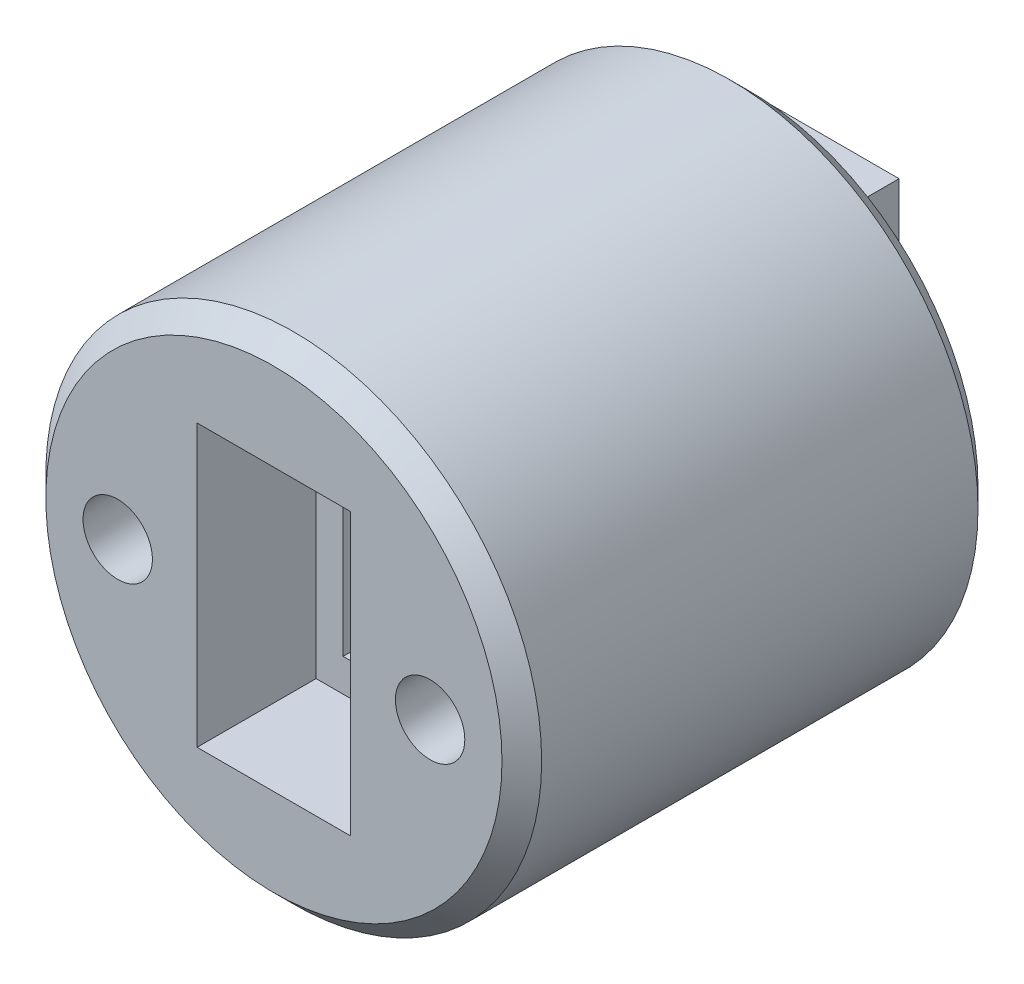
ISO-10303-21;
HEADER;
FILE_DESCRIPTION(('STEP AP214'),'2;1');
FILE_NAME('part.step','',(''),(''),'','','');
FILE_SCHEMA(('AUTOMOTIVE_DESIGN { 1 0 10303 214 1 1 1 1 }'));
ENDSEC;
DATA;
#1=APPLICATION_CONTEXT('core data for automotive mechanical design processes');
#2=APPLICATION_PROTOCOL_DEFINITION('international standard','automotive_design',2000,#1);
#3=PRODUCT_CONTEXT('',#1,'mechanical');
#4=PRODUCT('Part','Part','',(#3));
#5=PRODUCT_RELATED_PRODUCT_CATEGORY('part','',(#4));
#6=PRODUCT_DEFINITION_FORMATION('','',#4);
#7=PRODUCT_DEFINITION_CONTEXT('part definition',#1,'design');
#8=PRODUCT_DEFINITION('design','',#6,#7);
#9=PRODUCT_DEFINITION_SHAPE('','',#8);
#10=(LENGTH_UNIT() NAMED_UNIT(*) SI_UNIT(.MILLI.,.METRE.));
#11=(NAMED_UNIT(*) PLANE_ANGLE_UNIT() SI_UNIT($,.RADIAN.));
#12=(NAMED_UNIT(*) SI_UNIT($,.STERADIAN.) SOLID_ANGLE_UNIT());
#13=UNCERTAINTY_MEASURE_WITH_UNIT(LENGTH_MEASURE(1.E-05),#10,'distance_accuracy_value','');
#14=(GEOMETRIC_REPRESENTATION_CONTEXT(3) GLOBAL_UNCERTAINTY_ASSIGNED_CONTEXT((#13)) GLOBAL_UNIT_ASSIGNED_CONTEXT((#10,
#11,#12)) REPRESENTATION_CONTEXT('',''));
#15=CARTESIAN_POINT('',(0.,0.,0.));
#16=DIRECTION('',(0.,0.,1.));
#17=DIRECTION('',(1.,0.,0.));
#18=AXIS2_PLACEMENT_3D('',#15,#16,#17);
#19=CARTESIAN_POINT('',(0.,0.,0.));
#20=DIRECTION('',(0.,0.,1.));
#21=DIRECTION('',(1.,0.,0.));
#22=AXIS2_PLACEMENT_3D('',#19,#20,#21);
#23=PLANE('',#22);
#24=CARTESIAN_POINT('',(-7.875,0.,0.));
#25=DIRECTION('',(0.,0.,1.));
#26=DIRECTION('',(1.,0.,0.));
#27=AXIS2_PLACEMENT_3D('',#24,#25,#26);
#28=CIRCLE('',#27,1.75);
#29=CARTESIAN_POINT('',(-6.125,0.,0.));
#30=VERTEX_POINT('',#29);
#31=EDGE_CURVE('E205',#30,#30,#28,.T.);
#32=ORIENTED_EDGE('',*,*,#31,.T.);
#33=EDGE_LOOP('',(#32));
#34=FACE_BOUND('',#33,.T.);
#35=CARTESIAN_POINT('',(7.875,0.,0.));
#36=DIRECTION('',(0.,0.,1.));
#37=DIRECTION('',(1.,0.,0.));
#38=AXIS2_PLACEMENT_3D('',#35,#36,#37);
#39=CIRCLE('',#38,1.75);
#40=CARTESIAN_POINT('',(9.625,0.,0.));
#41=VERTEX_POINT('',#40);
#42=EDGE_CURVE('E198',#41,#41,#39,.T.);
#43=ORIENTED_EDGE('',*,*,#42,.T.);
#44=EDGE_LOOP('',(#43));
#45=FACE_BOUND('',#44,.T.);
#46=CARTESIAN_POINT('',(0.,0.,0.));
#47=DIRECTION('',(0.,0.,1.));
#48=DIRECTION('',(1.,0.,0.));
#49=AXIS2_PLACEMENT_3D('',#46,#47,#48);
#50=CIRCLE('',#49,11.5);
#51=CARTESIAN_POINT('',(11.5,0.,0.));
#52=VERTEX_POINT('',#51);
#53=EDGE_CURVE('E325',#52,#52,#50,.F.);
#54=ORIENTED_EDGE('',*,*,#53,.T.);
#55=EDGE_LOOP('',(#54));
#56=FACE_BOUND('',#55,.T.);
#57=DIRECTION('',(0.,1.,0.));
#58=VECTOR('',#57,1.);
#59=CARTESIAN_POINT('',(-3.52077735464872,7.4439292641144,0.));
#60=LINE('',#59,#58);
#61=CARTESIAN_POINT('',(-3.52077735464872,-7.4439292641144,0.));
#62=VERTEX_POINT('',#61);
#63=CARTESIAN_POINT('',(-3.52077735464872,7.4439292641144,0.));
#64=VERTEX_POINT('',#63);
#65=EDGE_CURVE('E210',#62,#64,#60,.T.);
#66=ORIENTED_EDGE('',*,*,#65,.F.);
#67=DIRECTION('',(-1.,0.,0.));
#68=VECTOR('',#67,1.);
#69=CARTESIAN_POINT('',(3.52077735464872,-7.4439292641144,0.));
#70=LINE('',#69,#68);
#71=CARTESIAN_POINT('',(3.52077735464872,-7.4439292641144,0.));
#72=VERTEX_POINT('',#71);
#73=EDGE_CURVE('E223',#72,#62,#70,.T.);
#74=ORIENTED_EDGE('',*,*,#73,.F.);
#75=DIRECTION('',(0.,-1.,0.));
#76=VECTOR('',#75,1.);
#77=CARTESIAN_POINT('',(3.52077735464872,7.4439292641144,0.));
#78=LINE('',#77,#76);
#79=CARTESIAN_POINT('',(3.52077735464872,7.4439292641144,0.));
#80=VERTEX_POINT('',#79);
#81=EDGE_CURVE('E219',#80,#72,#78,.T.);
#82=ORIENTED_EDGE('',*,*,#81,.F.);
#83=DIRECTION('',(1.,0.,0.));
#84=VECTOR('',#83,1.);
#85=CARTESIAN_POINT('',(3.52077735464872,7.4439292641144,0.));
#86=LINE('',#85,#84);
#87=EDGE_CURVE('E214',#64,#80,#86,.T.);
#88=ORIENTED_EDGE('',*,*,#87,.F.);
#89=EDGE_LOOP('',(#66,#74,#82,#88));
#90=FACE_BOUND('',#89,.T.);
#91=ADVANCED_FACE('F41',(#34,#45,#56,#90),#23,.F.);
#92=CARTESIAN_POINT('',(0.,0.,24.));
#93=DIRECTION('',(0.,0.,-1.));
#94=DIRECTION('',(-1.,0.,0.));
#95=AXIS2_PLACEMENT_3D('',#92,#93,#94);
#96=CYLINDRICAL_SURFACE('',#95,12.5);
#97=CARTESIAN_POINT('',(0.,0.,23.));
#98=DIRECTION('',(0.,0.,1.));
#99=DIRECTION('',(1.,0.,0.));
#100=AXIS2_PLACEMENT_3D('',#97,#98,#99);
#101=CIRCLE('',#100,12.5);
#102=CARTESIAN_POINT('',(12.5,0.,23.));
#103=VERTEX_POINT('',#102);
#104=EDGE_CURVE('E11',#103,#103,#101,.F.);
#105=ORIENTED_EDGE('',*,*,#104,.T.);
#106=EDGE_LOOP('',(#105));
#107=FACE_BOUND('',#106,.T.);
#108=CARTESIAN_POINT('',(0.,0.,1.));
#109=DIRECTION('',(0.,0.,1.));
#110=DIRECTION('',(1.,0.,0.));
#111=AXIS2_PLACEMENT_3D('',#108,#109,#110);
#112=CIRCLE('',#111,12.5);
#113=CARTESIAN_POINT('',(12.5,0.,1.));
#114=VERTEX_POINT('',#113);
#115=EDGE_CURVE('E309',#114,#114,#112,.T.);
#116=ORIENTED_EDGE('',*,*,#115,.T.);
#117=EDGE_LOOP('',(#116));
#118=FACE_BOUND('',#117,.T.);
#119=ADVANCED_FACE('F349',(#107,#118),#96,.T.);
#120=CARTESIAN_POINT('',(0.,0.,24.));
#121=DIRECTION('',(0.,0.,1.));
#122=DIRECTION('',(1.,0.,0.));
#123=AXIS2_PLACEMENT_3D('',#120,#121,#122);
#124=PLANE('',#123);
#125=CARTESIAN_POINT('',(0.,0.,24.));
#126=DIRECTION('',(0.,0.,1.));
#127=DIRECTION('',(1.,0.,0.));
#128=AXIS2_PLACEMENT_3D('',#125,#126,#127);
#129=CIRCLE('',#128,11.5);
#130=CARTESIAN_POINT('',(11.5,0.,24.));
#131=VERTEX_POINT('',#130);
#132=EDGE_CURVE('E51',#131,#131,#129,.T.);
#133=ORIENTED_EDGE('',*,*,#132,.T.);
#134=EDGE_LOOP('',(#133));
#135=FACE_BOUND('',#134,.T.);
#136=CARTESIAN_POINT('',(-7.875,0.,24.));
#137=DIRECTION('',(0.,0.,1.));
#138=DIRECTION('',(1.,0.,0.));
#139=AXIS2_PLACEMENT_3D('',#136,#137,#138);
#140=CIRCLE('',#139,1.75);
#141=CARTESIAN_POINT('',(-6.125,0.,24.));
#142=VERTEX_POINT('',#141);
#143=EDGE_CURVE('E194',#142,#142,#140,.T.);
#144=ORIENTED_EDGE('',*,*,#143,.F.);
#145=EDGE_LOOP('',(#144));
#146=FACE_BOUND('',#145,.T.);
#147=CARTESIAN_POINT('',(7.875,0.,24.));
#148=DIRECTION('',(0.,0.,1.));
#149=DIRECTION('',(-1.,0.,0.));
#150=AXIS2_PLACEMENT_3D('',#147,#148,#149);
#151=CIRCLE('',#150,1.75);
#152=CARTESIAN_POINT('',(9.625,0.,24.));
#153=VERTEX_POINT('',#152);
#154=EDGE_CURVE('E188',#153,#153,#151,.T.);
#155=ORIENTED_EDGE('',*,*,#154,.F.);
#156=EDGE_LOOP('',(#155));
#157=FACE_BOUND('',#156,.T.);
#158=DIRECTION('',(0.,1.,0.));
#159=VECTOR('',#158,1.);
#160=CARTESIAN_POINT('',(3.87302995142412,7.08115133493844,24.));
#161=LINE('',#160,#159);
#162=CARTESIAN_POINT('',(3.87302995142412,-7.08115133493844,24.));
#163=VERTEX_POINT('',#162);
#164=CARTESIAN_POINT('',(3.87302995142412,7.08115133493844,24.));
#165=VERTEX_POINT('',#164);
#166=EDGE_CURVE('E239',#163,#165,#161,.T.);
#167=ORIENTED_EDGE('',*,*,#166,.F.);
#168=DIRECTION('',(1.,0.,0.));
#169=VECTOR('',#168,1.);
#170=CARTESIAN_POINT('',(-3.87302995142412,-7.08115133493844,24.));
#171=LINE('',#170,#169);
#172=CARTESIAN_POINT('',(-3.87302995142412,-7.08115133493844,24.));
#173=VERTEX_POINT('',#172);
#174=EDGE_CURVE('E245',#173,#163,#171,.T.);
#175=ORIENTED_EDGE('',*,*,#174,.F.);
#176=DIRECTION('',(0.,-1.,0.));
#177=VECTOR('',#176,1.);
#178=CARTESIAN_POINT('',(-3.87302995142412,7.08115133493844,24.));
#179=LINE('',#178,#177);
#180=CARTESIAN_POINT('',(-3.87302995142412,7.08115133493844,24.));
#181=VERTEX_POINT('',#180);
#182=EDGE_CURVE('E264',#181,#173,#179,.T.);
#183=ORIENTED_EDGE('',*,*,#182,.F.);
#184=DIRECTION('',(-1.,0.,0.));
#185=VECTOR('',#184,1.);
#186=CARTESIAN_POINT('',(-3.87302995142412,7.08115133493844,24.));
#187=LINE('',#186,#185);
#188=EDGE_CURVE('E260',#165,#181,#187,.T.);
#189=ORIENTED_EDGE('',*,*,#188,.F.);
#190=EDGE_LOOP('',(#167,#175,#183,#189));
#191=FACE_BOUND('',#190,.T.);
#192=ADVANCED_FACE('F332',(#135,#146,#157,#191),#124,.T.);
#193=CARTESIAN_POINT('',(3.87302995142412,7.08115133493844,18.));
#194=DIRECTION('',(1.,0.,0.));
#195=DIRECTION('',(0.,0.,-1.));
#196=AXIS2_PLACEMENT_3D('',#193,#194,#195);
#197=PLANE('',#196);
#198=ORIENTED_EDGE('',*,*,#166,.T.);
#199=DIRECTION('',(0.,0.,1.));
#200=VECTOR('',#199,1.);
#201=CARTESIAN_POINT('',(3.87302995142412,7.08115133493844,18.));
#202=LINE('',#201,#200);
#203=CARTESIAN_POINT('',(3.87302995142412,7.08115133493844,18.));
#204=VERTEX_POINT('',#203);
#205=EDGE_CURVE('E257',#204,#165,#202,.T.);
#206=ORIENTED_EDGE('',*,*,#205,.F.);
#207=DIRECTION('',(0.,1.,0.));
#208=VECTOR('',#207,1.);
#209=CARTESIAN_POINT('',(3.87302995142412,7.08115133493844,18.));
#210=LINE('',#209,#208);
#211=CARTESIAN_POINT('',(3.87302995142412,-7.08115133493844,18.));
#212=VERTEX_POINT('',#211);
#213=EDGE_CURVE('E240',#212,#204,#210,.T.);
#214=ORIENTED_EDGE('',*,*,#213,.F.);
#215=DIRECTION('',(0.,0.,1.));
#216=VECTOR('',#215,1.);
#217=CARTESIAN_POINT('',(3.87302995142412,-7.08115133493844,18.));
#218=LINE('',#217,#216);
#219=EDGE_CURVE('E271',#212,#163,#218,.T.);
#220=ORIENTED_EDGE('',*,*,#219,.T.);
#221=EDGE_LOOP('',(#198,#206,#214,#220));
#222=FACE_BOUND('',#221,.T.);
#223=ADVANCED_FACE('F450',(#222),#197,.F.);
#224=CARTESIAN_POINT('',(-3.87302995142412,-7.08115133493844,18.));
#225=DIRECTION('',(0.,-1.,0.));
#226=DIRECTION('',(0.,0.,-1.));
#227=AXIS2_PLACEMENT_3D('',#224,#225,#226);
#228=PLANE('',#227);
#229=ORIENTED_EDGE('',*,*,#174,.T.);
#230=ORIENTED_EDGE('',*,*,#219,.F.);
#231=DIRECTION('',(1.,0.,0.));
#232=VECTOR('',#231,1.);
#233=CARTESIAN_POINT('',(-3.87302995142412,-7.08115133493844,18.));
#234=LINE('',#233,#232);
#235=CARTESIAN_POINT('',(-3.87302995142412,-7.08115133493844,18.));
#236=VERTEX_POINT('',#235);
#237=EDGE_CURVE('E253',#236,#212,#234,.T.);
#238=ORIENTED_EDGE('',*,*,#237,.F.);
#239=DIRECTION('',(0.,0.,1.));
#240=VECTOR('',#239,1.);
#241=CARTESIAN_POINT('',(-3.87302995142412,-7.08115133493844,18.));
#242=LINE('',#241,#240);
#243=EDGE_CURVE('E275',#236,#173,#242,.T.);
#244=ORIENTED_EDGE('',*,*,#243,.T.);
#245=EDGE_LOOP('',(#229,#230,#238,#244));
#246=FACE_BOUND('',#245,.T.);
#247=ADVANCED_FACE('F446',(#246),#228,.F.);
#248=CARTESIAN_POINT('',(-3.87302995142412,7.08115133493844,18.));
#249=DIRECTION('',(-1.,0.,0.));
#250=DIRECTION('',(0.,0.,1.));
#251=AXIS2_PLACEMENT_3D('',#248,#249,#250);
#252=PLANE('',#251);
#253=ORIENTED_EDGE('',*,*,#182,.T.);
#254=ORIENTED_EDGE('',*,*,#243,.F.);
#255=DIRECTION('',(0.,-1.,0.));
#256=VECTOR('',#255,1.);
#257=CARTESIAN_POINT('',(-3.87302995142412,7.08115133493844,18.));
#258=LINE('',#257,#256);
#259=CARTESIAN_POINT('',(-3.87302995142412,7.08115133493844,18.));
#260=VERTEX_POINT('',#259);
#261=EDGE_CURVE('E249',#260,#236,#258,.T.);
#262=ORIENTED_EDGE('',*,*,#261,.F.);
#263=DIRECTION('',(0.,0.,1.));
#264=VECTOR('',#263,1.);
#265=CARTESIAN_POINT('',(-3.87302995142412,7.08115133493844,18.));
#266=LINE('',#265,#264);
#267=EDGE_CURVE('E278',#260,#181,#266,.T.);
#268=ORIENTED_EDGE('',*,*,#267,.T.);
#269=EDGE_LOOP('',(#253,#254,#262,#268));
#270=FACE_BOUND('',#269,.T.);
#271=ADVANCED_FACE('F449',(#270),#252,.F.);
#272=CARTESIAN_POINT('',(-3.87302995142412,7.08115133493844,18.));
#273=DIRECTION('',(0.,1.,0.));
#274=DIRECTION('',(0.,0.,1.));
#275=AXIS2_PLACEMENT_3D('',#272,#273,#274);
#276=PLANE('',#275);
#277=ORIENTED_EDGE('',*,*,#188,.T.);
#278=ORIENTED_EDGE('',*,*,#267,.F.);
#279=DIRECTION('',(-1.,0.,0.));
#280=VECTOR('',#279,1.);
#281=CARTESIAN_POINT('',(-3.87302995142412,7.08115133493844,18.));
#282=LINE('',#281,#280);
#283=EDGE_CURVE('E244',#204,#260,#282,.T.);
#284=ORIENTED_EDGE('',*,*,#283,.F.);
#285=ORIENTED_EDGE('',*,*,#205,.T.);
#286=EDGE_LOOP('',(#277,#278,#284,#285));
#287=FACE_BOUND('',#286,.T.);
#288=ADVANCED_FACE('F441',(#287),#276,.F.);
#289=CARTESIAN_POINT('',(0.,0.,18.));
#290=DIRECTION('',(0.,0.,1.));
#291=DIRECTION('',(1.,0.,0.));
#292=AXIS2_PLACEMENT_3D('',#289,#290,#291);
#293=PLANE('',#292);
#294=DIRECTION('',(0.,1.,0.));
#295=VECTOR('',#294,1.);
#296=CARTESIAN_POINT('',(2.51484096760623,5.43205649002941,18.));
#297=LINE('',#296,#295);
#298=CARTESIAN_POINT('',(2.51484096760623,-5.43205649002941,18.));
#299=VERTEX_POINT('',#298);
#300=CARTESIAN_POINT('',(2.51484096760623,5.43205649002941,18.));
#301=VERTEX_POINT('',#300);
#302=EDGE_CURVE('E150',#299,#301,#297,.T.);
#303=ORIENTED_EDGE('',*,*,#302,.F.);
#304=DIRECTION('',(1.,0.,0.));
#305=VECTOR('',#304,1.);
#306=CARTESIAN_POINT('',(-2.51484096760623,-5.43205649002941,18.));
#307=LINE('',#306,#305);
#308=CARTESIAN_POINT('',(-2.51484096760623,-5.43205649002941,18.));
#309=VERTEX_POINT('',#308);
#310=EDGE_CURVE('E168',#309,#299,#307,.T.);
#311=ORIENTED_EDGE('',*,*,#310,.F.);
#312=DIRECTION('',(0.,-1.,0.));
#313=VECTOR('',#312,1.);
#314=CARTESIAN_POINT('',(-2.51484096760623,5.43205649002941,18.));
#315=LINE('',#314,#313);
#316=CARTESIAN_POINT('',(-2.51484096760623,5.43205649002941,18.));
#317=VERTEX_POINT('',#316);
#318=EDGE_CURVE('E58',#317,#309,#315,.T.);
#319=ORIENTED_EDGE('',*,*,#318,.F.);
#320=DIRECTION('',(-1.,0.,0.));
#321=VECTOR('',#320,1.);
#322=CARTESIAN_POINT('',(-2.51484096760623,5.43205649002941,18.));
#323=LINE('',#322,#321);
#324=EDGE_CURVE('E180',#301,#317,#323,.T.);
#325=ORIENTED_EDGE('',*,*,#324,.F.);
#326=EDGE_LOOP('',(#303,#311,#319,#325));
#327=FACE_BOUND('',#326,.T.);
#328=ORIENTED_EDGE('',*,*,#213,.T.);
#329=ORIENTED_EDGE('',*,*,#283,.T.);
#330=ORIENTED_EDGE('',*,*,#261,.T.);
#331=ORIENTED_EDGE('',*,*,#237,.T.);
#332=EDGE_LOOP('',(#328,#329,#330,#331));
#333=FACE_BOUND('',#332,.T.);
#334=ADVANCED_FACE('F434',(#327,#333),#293,.T.);
#335=CARTESIAN_POINT('',(-3.52077735464872,7.4439292641144,-5.));
#336=DIRECTION('',(1.,0.,0.));
#337=DIRECTION('',(0.,0.,-1.));
#338=AXIS2_PLACEMENT_3D('',#335,#336,#337);
#339=PLANE('',#338);
#340=DIRECTION('',(0.,0.,1.));
#341=VECTOR('',#340,1.);
#342=CARTESIAN_POINT('',(-3.52077735464872,7.4439292641144,-5.));
#343=LINE('',#342,#341);
#344=CARTESIAN_POINT('',(-3.52077735464872,7.4439292641144,-4.));
#345=VERTEX_POINT('',#344);
#346=EDGE_CURVE('E236',#345,#64,#343,.T.);
#347=ORIENTED_EDGE('',*,*,#346,.F.);
#348=DIRECTION('',(0.,-1.,0.));
#349=VECTOR('',#348,1.);
#350=CARTESIAN_POINT('',(-3.52077735464872,-7.4439292641144,-4.));
#351=LINE('',#350,#349);
#352=CARTESIAN_POINT('',(-3.52077735464872,-7.4439292641144,-4.));
#353=VERTEX_POINT('',#352);
#354=EDGE_CURVE('E296',#345,#353,#351,.T.);
#355=ORIENTED_EDGE('',*,*,#354,.T.);
#356=DIRECTION('',(0.,0.,1.));
#357=VECTOR('',#356,1.);
#358=CARTESIAN_POINT('',(-3.52077735464872,-7.4439292641144,-5.));
#359=LINE('',#358,#357);
#360=EDGE_CURVE('E227',#353,#62,#359,.T.);
#361=ORIENTED_EDGE('',*,*,#360,.T.);
#362=ORIENTED_EDGE('',*,*,#65,.T.);
#363=EDGE_LOOP('',(#347,#355,#361,#362));
#364=FACE_BOUND('',#363,.T.);
#365=ADVANCED_FACE('F432',(#364),#339,.F.);
#366=CARTESIAN_POINT('',(3.52077735464872,7.4439292641144,-5.));
#367=DIRECTION('',(0.,-1.,0.));
#368=DIRECTION('',(0.,0.,-1.));
#369=AXIS2_PLACEMENT_3D('',#366,#367,#368);
#370=PLANE('',#369);
#371=DIRECTION('',(0.,0.,1.));
#372=VECTOR('',#371,1.);
#373=CARTESIAN_POINT('',(3.52077735464872,7.4439292641144,-5.));
#374=LINE('',#373,#372);
#375=CARTESIAN_POINT('',(3.52077735464872,7.4439292641144,-4.));
#376=VERTEX_POINT('',#375);
#377=EDGE_CURVE('E233',#376,#80,#374,.T.);
#378=ORIENTED_EDGE('',*,*,#377,.F.);
#379=DIRECTION('',(-1.,0.,0.));
#380=VECTOR('',#379,1.);
#381=CARTESIAN_POINT('',(-3.52077735464872,7.4439292641144,-4.));
#382=LINE('',#381,#380);
#383=EDGE_CURVE('E303',#376,#345,#382,.T.);
#384=ORIENTED_EDGE('',*,*,#383,.T.);
#385=ORIENTED_EDGE('',*,*,#346,.T.);
#386=ORIENTED_EDGE('',*,*,#87,.T.);
#387=EDGE_LOOP('',(#378,#384,#385,#386));
#388=FACE_BOUND('',#387,.T.);
#389=ADVANCED_FACE('F430',(#388),#370,.F.);
#390=CARTESIAN_POINT('',(3.52077735464872,7.4439292641144,-5.));
#391=DIRECTION('',(-1.,0.,0.));
#392=DIRECTION('',(0.,0.,1.));
#393=AXIS2_PLACEMENT_3D('',#390,#391,#392);
#394=PLANE('',#393);
#395=DIRECTION('',(0.,0.,1.));
#396=VECTOR('',#395,1.);
#397=CARTESIAN_POINT('',(3.52077735464872,-7.4439292641144,-5.));
#398=LINE('',#397,#396);
#399=CARTESIAN_POINT('',(3.52077735464872,-7.4439292641144,-4.));
#400=VERTEX_POINT('',#399);
#401=EDGE_CURVE('E230',#400,#72,#398,.T.);
#402=ORIENTED_EDGE('',*,*,#401,.F.);
#403=DIRECTION('',(0.,1.,0.));
#404=VECTOR('',#403,1.);
#405=CARTESIAN_POINT('',(3.52077735464872,7.4439292641144,-4.));
#406=LINE('',#405,#404);
#407=EDGE_CURVE('E306',#400,#376,#406,.T.);
#408=ORIENTED_EDGE('',*,*,#407,.T.);
#409=ORIENTED_EDGE('',*,*,#377,.T.);
#410=ORIENTED_EDGE('',*,*,#81,.T.);
#411=EDGE_LOOP('',(#402,#408,#409,#410));
#412=FACE_BOUND('',#411,.T.);
#413=ADVANCED_FACE('F418',(#412),#394,.F.);
#414=CARTESIAN_POINT('',(3.52077735464872,-7.4439292641144,-5.));
#415=DIRECTION('',(0.,1.,0.));
#416=DIRECTION('',(0.,0.,1.));
#417=AXIS2_PLACEMENT_3D('',#414,#415,#416);
#418=PLANE('',#417);
#419=ORIENTED_EDGE('',*,*,#360,.F.);
#420=DIRECTION('',(1.,0.,0.));
#421=VECTOR('',#420,1.);
#422=CARTESIAN_POINT('',(3.52077735464872,-7.4439292641144,-4.));
#423=LINE('',#422,#421);
#424=EDGE_CURVE('E300',#353,#400,#423,.T.);
#425=ORIENTED_EDGE('',*,*,#424,.T.);
#426=ORIENTED_EDGE('',*,*,#401,.T.);
#427=ORIENTED_EDGE('',*,*,#73,.T.);
#428=EDGE_LOOP('',(#419,#425,#426,#427));
#429=FACE_BOUND('',#428,.T.);
#430=ADVANCED_FACE('F413',(#429),#418,.F.);
#431=CARTESIAN_POINT('',(0.,0.,-5.));
#432=DIRECTION('',(0.,0.,-1.));
#433=DIRECTION('',(-1.,0.,0.));
#434=AXIS2_PLACEMENT_3D('',#431,#432,#433);
#435=PLANE('',#434);
#436=DIRECTION('',(0.,1.,0.));
#437=VECTOR('',#436,1.);
#438=CARTESIAN_POINT('',(2.51484096760623,5.43205649002941,-5.));
#439=LINE('',#438,#437);
#440=CARTESIAN_POINT('',(2.51484096760623,-5.43205649002941,-5.));
#441=VERTEX_POINT('',#440);
#442=CARTESIAN_POINT('',(2.51484096760623,5.43205649002941,-5.));
#443=VERTEX_POINT('',#442);
#444=EDGE_CURVE('E147',#441,#443,#439,.T.);
#445=ORIENTED_EDGE('',*,*,#444,.T.);
#446=DIRECTION('',(-1.,0.,0.));
#447=VECTOR('',#446,1.);
#448=CARTESIAN_POINT('',(-2.51484096760623,5.43205649002941,-5.));
#449=LINE('',#448,#447);
#450=CARTESIAN_POINT('',(-2.51484096760623,5.43205649002941,-5.));
#451=VERTEX_POINT('',#450);
#452=EDGE_CURVE('E159',#443,#451,#449,.T.);
#453=ORIENTED_EDGE('',*,*,#452,.T.);
#454=DIRECTION('',(0.,-1.,0.));
#455=VECTOR('',#454,1.);
#456=CARTESIAN_POINT('',(-2.51484096760623,5.43205649002941,-5.));
#457=LINE('',#456,#455);
#458=CARTESIAN_POINT('',(-2.51484096760623,-5.43205649002941,-5.));
#459=VERTEX_POINT('',#458);
#460=EDGE_CURVE('E63',#451,#459,#457,.T.);
#461=ORIENTED_EDGE('',*,*,#460,.T.);
#462=DIRECTION('',(1.,0.,0.));
#463=VECTOR('',#462,1.);
#464=CARTESIAN_POINT('',(-2.51484096760623,-5.43205649002941,-5.));
#465=LINE('',#464,#463);
#466=EDGE_CURVE('E156',#459,#441,#465,.T.);
#467=ORIENTED_EDGE('',*,*,#466,.T.);
#468=EDGE_LOOP('',(#445,#453,#461,#467));
#469=FACE_BOUND('',#468,.T.);
#470=DIRECTION('',(-1.,0.,0.));
#471=VECTOR('',#470,1.);
#472=CARTESIAN_POINT('',(-3.52077735464872,-6.44392926411441,-5.));
#473=LINE('',#472,#471);
#474=CARTESIAN_POINT('',(2.52077735464873,-6.44392926411441,-5.));
#475=VERTEX_POINT('',#474);
#476=CARTESIAN_POINT('',(-2.52077735464873,-6.44392926411441,-5.));
#477=VERTEX_POINT('',#476);
#478=EDGE_CURVE('E289',#475,#477,#473,.T.);
#479=ORIENTED_EDGE('',*,*,#478,.T.);
#480=DIRECTION('',(0.,1.,0.));
#481=VECTOR('',#480,1.);
#482=CARTESIAN_POINT('',(-2.52077735464873,7.4439292641144,-5.));
#483=LINE('',#482,#481);
#484=CARTESIAN_POINT('',(-2.52077735464873,6.44392926411441,-5.));
#485=VERTEX_POINT('',#484);
#486=EDGE_CURVE('E292',#477,#485,#483,.T.);
#487=ORIENTED_EDGE('',*,*,#486,.T.);
#488=DIRECTION('',(1.,0.,0.));
#489=VECTOR('',#488,1.);
#490=CARTESIAN_POINT('',(3.52077735464872,6.44392926411441,-5.));
#491=LINE('',#490,#489);
#492=CARTESIAN_POINT('',(2.52077735464873,6.44392926411441,-5.));
#493=VERTEX_POINT('',#492);
#494=EDGE_CURVE('E286',#485,#493,#491,.T.);
#495=ORIENTED_EDGE('',*,*,#494,.T.);
#496=DIRECTION('',(0.,-1.,0.));
#497=VECTOR('',#496,1.);
#498=CARTESIAN_POINT('',(2.52077735464873,-7.4439292641144,-5.));
#499=LINE('',#498,#497);
#500=EDGE_CURVE('E274',#493,#475,#499,.T.);
#501=ORIENTED_EDGE('',*,*,#500,.T.);
#502=EDGE_LOOP('',(#479,#487,#495,#501));
#503=FACE_BOUND('',#502,.T.);
#504=ADVANCED_FACE('F164',(#469,#503),#435,.T.);
#505=CARTESIAN_POINT('',(2.52077735464873,0.,-5.));
#506=DIRECTION('',(0.70710678118655,0.,-0.707106781186545));
#507=DIRECTION('',(0.,1.,0.));
#508=AXIS2_PLACEMENT_3D('',#505,#506,#507);
#509=PLANE('',#508);
#510=DIRECTION('',(0.577350269189624,0.577350269189624,0.577350269189628));
#511=VECTOR('',#510,1.);
#512=CARTESIAN_POINT('',(0.372800933277269,4.29595284274295,-7.14797642137147));
#513=LINE('',#512,#511);
#514=EDGE_CURVE('E315',#376,#493,#513,.F.);
#515=ORIENTED_EDGE('',*,*,#514,.F.);
#516=ORIENTED_EDGE('',*,*,#407,.F.);
#517=DIRECTION('',(-0.577350269189624,0.577350269189624,-0.577350269189628));
#518=VECTOR('',#517,1.);
#519=CARTESIAN_POINT('',(0.372800933277269,-4.29595284274295,-7.14797642137147));
#520=LINE('',#519,#518);
#521=EDGE_CURVE('E215',#475,#400,#520,.F.);
#522=ORIENTED_EDGE('',*,*,#521,.F.);
#523=ORIENTED_EDGE('',*,*,#500,.F.);
#524=EDGE_LOOP('',(#515,#516,#522,#523));
#525=FACE_BOUND('',#524,.T.);
#526=ADVANCED_FACE('F384',(#525),#509,.T.);
#527=CARTESIAN_POINT('',(0.,-6.44392926411441,-5.));
#528=DIRECTION('',(0.,-0.70710678118655,-0.707106781186545));
#529=DIRECTION('',(1.,0.,0.));
#530=AXIS2_PLACEMENT_3D('',#527,#528,#529);
#531=PLANE('',#530);
#532=ORIENTED_EDGE('',*,*,#521,.T.);
#533=ORIENTED_EDGE('',*,*,#424,.F.);
#534=DIRECTION('',(0.577350269189624,0.577350269189624,-0.577350269189628));
#535=VECTOR('',#534,1.);
#536=CARTESIAN_POINT('',(-1.68051823643249,-5.60367014589817,-5.84025911821625));
#537=LINE('',#536,#535);
#538=EDGE_CURVE('E312',#477,#353,#537,.F.);
#539=ORIENTED_EDGE('',*,*,#538,.F.);
#540=ORIENTED_EDGE('',*,*,#478,.F.);
#541=EDGE_LOOP('',(#532,#533,#539,#540));
#542=FACE_BOUND('',#541,.T.);
#543=ADVANCED_FACE('F377',(#542),#531,.T.);
#544=CARTESIAN_POINT('',(0.,6.44392926411441,-5.));
#545=DIRECTION('',(0.,0.70710678118655,-0.707106781186545));
#546=DIRECTION('',(-1.,0.,0.));
#547=AXIS2_PLACEMENT_3D('',#544,#545,#546);
#548=PLANE('',#547);
#549=ORIENTED_EDGE('',*,*,#514,.T.);
#550=ORIENTED_EDGE('',*,*,#494,.F.);
#551=DIRECTION('',(-0.577350269189624,0.577350269189624,0.577350269189628));
#552=VECTOR('',#551,1.);
#553=CARTESIAN_POINT('',(-1.68051823643249,5.60367014589817,-5.84025911821625));
#554=LINE('',#553,#552);
#555=EDGE_CURVE('E209',#345,#485,#554,.F.);
#556=ORIENTED_EDGE('',*,*,#555,.F.);
#557=ORIENTED_EDGE('',*,*,#383,.F.);
#558=EDGE_LOOP('',(#549,#550,#556,#557));
#559=FACE_BOUND('',#558,.T.);
#560=ADVANCED_FACE('F370',(#559),#548,.T.);
#561=CARTESIAN_POINT('',(-2.52077735464873,0.,-5.));
#562=DIRECTION('',(-0.70710678118655,0.,-0.707106781186545));
#563=DIRECTION('',(0.,-1.,0.));
#564=AXIS2_PLACEMENT_3D('',#561,#562,#563);
#565=PLANE('',#564);
#566=ORIENTED_EDGE('',*,*,#538,.T.);
#567=ORIENTED_EDGE('',*,*,#354,.F.);
#568=ORIENTED_EDGE('',*,*,#555,.T.);
#569=ORIENTED_EDGE('',*,*,#486,.F.);
#570=EDGE_LOOP('',(#566,#567,#568,#569));
#571=FACE_BOUND('',#570,.T.);
#572=ADVANCED_FACE('F362',(#571),#565,.T.);
#573=CARTESIAN_POINT('',(0.,0.,1.));
#574=DIRECTION('',(0.,0.,1.));
#575=DIRECTION('',(1.,0.,0.));
#576=AXIS2_PLACEMENT_3D('',#573,#574,#575);
#577=CONICAL_SURFACE('',#576,12.5,0.78539816339745);
#578=ORIENTED_EDGE('',*,*,#53,.F.);
#579=EDGE_LOOP('',(#578));
#580=FACE_BOUND('',#579,.T.);
#581=ORIENTED_EDGE('',*,*,#115,.F.);
#582=EDGE_LOOP('',(#581));
#583=FACE_BOUND('',#582,.T.);
#584=ADVANCED_FACE('F369',(#580,#583),#577,.T.);
#585=CARTESIAN_POINT('',(7.875,0.,-5.));
#586=DIRECTION('',(0.,0.,1.));
#587=DIRECTION('',(1.,0.,0.));
#588=AXIS2_PLACEMENT_3D('',#585,#586,#587);
#589=CYLINDRICAL_SURFACE('',#588,1.75);
#590=CARTESIAN_POINT('',(9.625,0.,24.));
#591=CARTESIAN_POINT('',(9.625,0.,23.75));
#592=CARTESIAN_POINT('',(9.625,0.,23.5));
#593=CARTESIAN_POINT('',(9.625,0.,23.));
#594=CARTESIAN_POINT('',(9.625,0.,22.75));
#595=CARTESIAN_POINT('',(9.625,0.,22.25));
#596=CARTESIAN_POINT('',(9.625,0.,22.));
#597=CARTESIAN_POINT('',(9.625,0.,21.5));
#598=CARTESIAN_POINT('',(9.625,0.,21.25));
#599=CARTESIAN_POINT('',(9.625,0.,20.75));
#600=CARTESIAN_POINT('',(9.625,0.,20.5));
#601=CARTESIAN_POINT('',(9.625,0.,20.));
#602=CARTESIAN_POINT('',(9.625,0.,19.75));
#603=CARTESIAN_POINT('',(9.625,0.,19.25));
#604=CARTESIAN_POINT('',(9.625,0.,19.));
#605=CARTESIAN_POINT('',(9.625,0.,18.5));
#606=CARTESIAN_POINT('',(9.625,0.,18.25));
#607=CARTESIAN_POINT('',(9.625,0.,17.75));
#608=CARTESIAN_POINT('',(9.625,0.,17.5));
#609=CARTESIAN_POINT('',(9.625,0.,17.));
#610=CARTESIAN_POINT('',(9.625,0.,16.75));
#611=CARTESIAN_POINT('',(9.625,0.,16.25));
#612=CARTESIAN_POINT('',(9.625,0.,16.));
#613=CARTESIAN_POINT('',(9.625,0.,15.5));
#614=CARTESIAN_POINT('',(9.625,0.,15.25));
#615=CARTESIAN_POINT('',(9.625,0.,14.75));
#616=CARTESIAN_POINT('',(9.625,0.,14.5));
#617=CARTESIAN_POINT('',(9.625,0.,14.));
#618=CARTESIAN_POINT('',(9.625,0.,13.75));
#619=CARTESIAN_POINT('',(9.625,0.,13.25));
#620=CARTESIAN_POINT('',(9.625,0.,13.));
#621=CARTESIAN_POINT('',(9.625,0.,12.5));
#622=CARTESIAN_POINT('',(9.625,0.,12.25));
#623=CARTESIAN_POINT('',(9.625,0.,11.75));
#624=CARTESIAN_POINT('',(9.625,0.,11.5));
#625=CARTESIAN_POINT('',(9.625,0.,11.));
#626=CARTESIAN_POINT('',(9.625,0.,10.75));
#627=CARTESIAN_POINT('',(9.625,0.,10.25));
#628=CARTESIAN_POINT('',(9.625,0.,10.));
#629=CARTESIAN_POINT('',(9.625,0.,9.5));
#630=CARTESIAN_POINT('',(9.625,0.,9.25));
#631=CARTESIAN_POINT('',(9.625,0.,8.75));
#632=CARTESIAN_POINT('',(9.625,0.,8.5));
#633=CARTESIAN_POINT('',(9.625,0.,8.));
#634=CARTESIAN_POINT('',(9.625,0.,7.75));
#635=CARTESIAN_POINT('',(9.625,0.,7.25));
#636=CARTESIAN_POINT('',(9.625,0.,7.));
#637=CARTESIAN_POINT('',(9.625,0.,6.5));
#638=CARTESIAN_POINT('',(9.625,0.,6.25));
#639=CARTESIAN_POINT('',(9.625,0.,5.75));
#640=CARTESIAN_POINT('',(9.625,0.,5.5));
#641=CARTESIAN_POINT('',(9.625,0.,5.));
#642=CARTESIAN_POINT('',(9.625,0.,4.75));
#643=CARTESIAN_POINT('',(9.625,0.,4.25));
#644=CARTESIAN_POINT('',(9.625,0.,4.));
#645=CARTESIAN_POINT('',(9.625,0.,3.5));
#646=CARTESIAN_POINT('',(9.625,0.,3.25));
#647=CARTESIAN_POINT('',(9.625,0.,2.75));
#648=CARTESIAN_POINT('',(9.625,0.,2.5));
#649=CARTESIAN_POINT('',(9.625,0.,2.));
#650=CARTESIAN_POINT('',(9.625,0.,1.75));
#651=CARTESIAN_POINT('',(9.625,0.,1.25));
#652=CARTESIAN_POINT('',(9.625,0.,1.));
#653=CARTESIAN_POINT('',(9.625,0.,0.5));
#654=CARTESIAN_POINT('',(9.625,0.,0.25));
#655=CARTESIAN_POINT('',(9.625,0.,0.));
#656=B_SPLINE_CURVE_WITH_KNOTS('',3,(#590,#591,#592,#593,#594,#595,#596,#597,#598,#599,#600,
#601,#602,#603,#604,#605,#606,#607,#608,#609,#610,#611,#612,#613,#614,#615,#616,#617,#618,#619,
#620,#621,#622,#623,#624,#625,#626,#627,#628,#629,#630,#631,#632,#633,#634,#635,#636,#637,#638,
#639,#640,#641,#642,#643,#644,#645,#646,#647,#648,#649,#650,#651,#652,#653,#654,#655),
.UNSPECIFIED.,.F.,.F.,(4,2,2,2,2,2,2,2,2,2,2,2,2,2,2,2,2,2,2,2,2,2,2,2,2,2,2,2,2,2,2,2,4),(0.,
0.750000000000001,1.5,2.25,3.,3.75,4.5,5.25,6.,6.75,7.5,8.25,9.,9.75,10.5,11.25,12.,12.75,13.5,
14.25,15.,15.75,16.5,17.25,18.,18.75,19.5,20.25,21.,21.75,22.5,23.25,24.),.UNSPECIFIED.);
#657=EDGE_CURVE('BSEAM344',#153,#41,#656,.T.);
#658=ORIENTED_EDGE('',*,*,#154,.T.);
#659=ORIENTED_EDGE('',*,*,#42,.F.);
#660=ORIENTED_EDGE('',*,*,#657,.T.);
#661=ORIENTED_EDGE('',*,*,#657,.F.);
#662=EDGE_LOOP('',(#658,#660,#659,#661));
#663=FACE_BOUND('',#662,.T.);
#664=ADVANCED_FACE('F344',(#663),#589,.F.);
#665=CARTESIAN_POINT('',(-7.875,0.,-5.));
#666=DIRECTION('',(0.,0.,1.));
#667=DIRECTION('',(1.,0.,0.));
#668=AXIS2_PLACEMENT_3D('',#665,#666,#667);
#669=CYLINDRICAL_SURFACE('',#668,1.75);
#670=CARTESIAN_POINT('',(-6.125,0.,24.));
#671=CARTESIAN_POINT('',(-6.125,0.,23.75));
#672=CARTESIAN_POINT('',(-6.125,0.,23.5));
#673=CARTESIAN_POINT('',(-6.125,0.,23.));
#674=CARTESIAN_POINT('',(-6.125,0.,22.75));
#675=CARTESIAN_POINT('',(-6.125,0.,22.25));
#676=CARTESIAN_POINT('',(-6.125,0.,22.));
#677=CARTESIAN_POINT('',(-6.125,0.,21.5));
#678=CARTESIAN_POINT('',(-6.125,0.,21.25));
#679=CARTESIAN_POINT('',(-6.125,0.,20.75));
#680=CARTESIAN_POINT('',(-6.125,0.,20.5));
#681=CARTESIAN_POINT('',(-6.125,0.,20.));
#682=CARTESIAN_POINT('',(-6.125,0.,19.75));
#683=CARTESIAN_POINT('',(-6.125,0.,19.25));
#684=CARTESIAN_POINT('',(-6.125,0.,19.));
#685=CARTESIAN_POINT('',(-6.125,0.,18.5));
#686=CARTESIAN_POINT('',(-6.125,0.,18.25));
#687=CARTESIAN_POINT('',(-6.125,0.,17.75));
#688=CARTESIAN_POINT('',(-6.125,0.,17.5));
#689=CARTESIAN_POINT('',(-6.125,0.,17.));
#690=CARTESIAN_POINT('',(-6.125,0.,16.75));
#691=CARTESIAN_POINT('',(-6.125,0.,16.25));
#692=CARTESIAN_POINT('',(-6.125,0.,16.));
#693=CARTESIAN_POINT('',(-6.125,0.,15.5));
#694=CARTESIAN_POINT('',(-6.125,0.,15.25));
#695=CARTESIAN_POINT('',(-6.125,0.,14.75));
#696=CARTESIAN_POINT('',(-6.125,0.,14.5));
#697=CARTESIAN_POINT('',(-6.125,0.,14.));
#698=CARTESIAN_POINT('',(-6.125,0.,13.75));
#699=CARTESIAN_POINT('',(-6.125,0.,13.25));
#700=CARTESIAN_POINT('',(-6.125,0.,13.));
#701=CARTESIAN_POINT('',(-6.125,0.,12.5));
#702=CARTESIAN_POINT('',(-6.125,0.,12.25));
#703=CARTESIAN_POINT('',(-6.125,0.,11.75));
#704=CARTESIAN_POINT('',(-6.125,0.,11.5));
#705=CARTESIAN_POINT('',(-6.125,0.,11.));
#706=CARTESIAN_POINT('',(-6.125,0.,10.75));
#707=CARTESIAN_POINT('',(-6.125,0.,10.25));
#708=CARTESIAN_POINT('',(-6.125,0.,10.));
#709=CARTESIAN_POINT('',(-6.125,0.,9.5));
#710=CARTESIAN_POINT('',(-6.125,0.,9.25));
#711=CARTESIAN_POINT('',(-6.125,0.,8.75));
#712=CARTESIAN_POINT('',(-6.125,0.,8.5));
#713=CARTESIAN_POINT('',(-6.125,0.,8.));
#714=CARTESIAN_POINT('',(-6.125,0.,7.75));
#715=CARTESIAN_POINT('',(-6.125,0.,7.25));
#716=CARTESIAN_POINT('',(-6.125,0.,7.));
#717=CARTESIAN_POINT('',(-6.125,0.,6.5));
#718=CARTESIAN_POINT('',(-6.125,0.,6.25));
#719=CARTESIAN_POINT('',(-6.125,0.,5.75));
#720=CARTESIAN_POINT('',(-6.125,0.,5.5));
#721=CARTESIAN_POINT('',(-6.125,0.,5.));
#722=CARTESIAN_POINT('',(-6.125,0.,4.75));
#723=CARTESIAN_POINT('',(-6.125,0.,4.25));
#724=CARTESIAN_POINT('',(-6.125,0.,4.));
#725=CARTESIAN_POINT('',(-6.125,0.,3.5));
#726=CARTESIAN_POINT('',(-6.125,0.,3.25));
#727=CARTESIAN_POINT('',(-6.125,0.,2.75));
#728=CARTESIAN_POINT('',(-6.125,0.,2.5));
#729=CARTESIAN_POINT('',(-6.125,0.,2.));
#730=CARTESIAN_POINT('',(-6.125,0.,1.75));
#731=CARTESIAN_POINT('',(-6.125,0.,1.25));
#732=CARTESIAN_POINT('',(-6.125,0.,1.));
#733=CARTESIAN_POINT('',(-6.125,0.,0.5));
#734=CARTESIAN_POINT('',(-6.125,0.,0.25));
#735=CARTESIAN_POINT('',(-6.125,0.,0.));
#736=B_SPLINE_CURVE_WITH_KNOTS('',3,(#670,#671,#672,#673,#674,#675,#676,#677,#678,#679,#680,
#681,#682,#683,#684,#685,#686,#687,#688,#689,#690,#691,#692,#693,#694,#695,#696,#697,#698,#699,
#700,#701,#702,#703,#704,#705,#706,#707,#708,#709,#710,#711,#712,#713,#714,#715,#716,#717,#718,
#719,#720,#721,#722,#723,#724,#725,#726,#727,#728,#729,#730,#731,#732,#733,#734,#735),
.UNSPECIFIED.,.F.,.F.,(4,2,2,2,2,2,2,2,2,2,2,2,2,2,2,2,2,2,2,2,2,2,2,2,2,2,2,2,2,2,2,2,4),(0.,
0.750000000000001,1.5,2.25,3.,3.75,4.5,5.25,6.,6.75,7.5,8.25,9.,9.75,10.5,11.25,12.,12.75,13.5,
14.25,15.,15.75,16.5,17.25,18.,18.75,19.5,20.25,21.,21.75,22.5,23.25,24.),.UNSPECIFIED.);
#737=EDGE_CURVE('BSEAM336',#142,#30,#736,.T.);
#738=ORIENTED_EDGE('',*,*,#143,.T.);
#739=ORIENTED_EDGE('',*,*,#31,.F.);
#740=ORIENTED_EDGE('',*,*,#737,.T.);
#741=ORIENTED_EDGE('',*,*,#737,.F.);
#742=EDGE_LOOP('',(#738,#740,#739,#741));
#743=FACE_BOUND('',#742,.T.);
#744=ADVANCED_FACE('F336',(#743),#669,.F.);
#745=CARTESIAN_POINT('',(0.,0.,24.));
#746=DIRECTION('',(0.,0.,-1.));
#747=DIRECTION('',(-1.,0.,0.));
#748=AXIS2_PLACEMENT_3D('',#745,#746,#747);
#749=CONICAL_SURFACE('',#748,11.5,0.785398163397443);
#750=ORIENTED_EDGE('',*,*,#104,.F.);
#751=EDGE_LOOP('',(#750));
#752=FACE_BOUND('',#751,.T.);
#753=ORIENTED_EDGE('',*,*,#132,.F.);
#754=EDGE_LOOP('',(#753));
#755=FACE_BOUND('',#754,.T.);
#756=ADVANCED_FACE('F44',(#752,#755),#749,.T.);
#757=CARTESIAN_POINT('',(2.51484096760623,5.43205649002941,-5.));
#758=DIRECTION('',(1.,0.,0.));
#759=DIRECTION('',(0.,0.,-1.));
#760=AXIS2_PLACEMENT_3D('',#757,#758,#759);
#761=PLANE('',#760);
#762=ORIENTED_EDGE('',*,*,#302,.T.);
#763=DIRECTION('',(0.,0.,1.));
#764=VECTOR('',#763,1.);
#765=CARTESIAN_POINT('',(2.51484096760623,5.43205649002941,-5.));
#766=LINE('',#765,#764);
#767=EDGE_CURVE('E143',#443,#301,#766,.T.);
#768=ORIENTED_EDGE('',*,*,#767,.F.);
#769=ORIENTED_EDGE('',*,*,#444,.F.);
#770=DIRECTION('',(0.,0.,1.));
#771=VECTOR('',#770,1.);
#772=CARTESIAN_POINT('',(2.51484096760623,-5.43205649002941,-5.));
#773=LINE('',#772,#771);
#774=EDGE_CURVE('E185',#441,#299,#773,.T.);
#775=ORIENTED_EDGE('',*,*,#774,.T.);
#776=EDGE_LOOP('',(#762,#768,#769,#775));
#777=FACE_BOUND('',#776,.T.);
#778=ADVANCED_FACE('F145',(#777),#761,.F.);
#779=CARTESIAN_POINT('',(-2.51484096760623,-5.43205649002941,-5.));
#780=DIRECTION('',(0.,-1.,0.));
#781=DIRECTION('',(0.,0.,-1.));
#782=AXIS2_PLACEMENT_3D('',#779,#780,#781);
#783=PLANE('',#782);
#784=ORIENTED_EDGE('',*,*,#310,.T.);
#785=ORIENTED_EDGE('',*,*,#774,.F.);
#786=ORIENTED_EDGE('',*,*,#466,.F.);
#787=DIRECTION('',(0.,0.,1.));
#788=VECTOR('',#787,1.);
#789=CARTESIAN_POINT('',(-2.51484096760623,-5.43205649002941,-5.));
#790=LINE('',#789,#788);
#791=EDGE_CURVE('E189',#459,#309,#790,.T.);
#792=ORIENTED_EDGE('',*,*,#791,.T.);
#793=EDGE_LOOP('',(#784,#785,#786,#792));
#794=FACE_BOUND('',#793,.T.);
#795=ADVANCED_FACE('F342',(#794),#783,.F.);
#796=CARTESIAN_POINT('',(-2.51484096760623,5.43205649002941,-5.));
#797=DIRECTION('',(-1.,0.,0.));
#798=DIRECTION('',(0.,0.,1.));
#799=AXIS2_PLACEMENT_3D('',#796,#797,#798);
#800=PLANE('',#799);
#801=ORIENTED_EDGE('',*,*,#318,.T.);
#802=ORIENTED_EDGE('',*,*,#791,.F.);
#803=ORIENTED_EDGE('',*,*,#460,.F.);
#804=DIRECTION('',(0.,0.,1.));
#805=VECTOR('',#804,1.);
#806=CARTESIAN_POINT('',(-2.51484096760623,5.43205649002941,-5.));
#807=LINE('',#806,#805);
#808=EDGE_CURVE('E155',#451,#317,#807,.T.);
#809=ORIENTED_EDGE('',*,*,#808,.T.);
#810=EDGE_LOOP('',(#801,#802,#803,#809));
#811=FACE_BOUND('',#810,.T.);
#812=ADVANCED_FACE('F602',(#811),#800,.F.);
#813=CARTESIAN_POINT('',(-2.51484096760623,5.43205649002941,-5.));
#814=DIRECTION('',(0.,1.,0.));
#815=DIRECTION('',(0.,0.,1.));
#816=AXIS2_PLACEMENT_3D('',#813,#814,#815);
#817=PLANE('',#816);
#818=ORIENTED_EDGE('',*,*,#324,.T.);
#819=ORIENTED_EDGE('',*,*,#808,.F.);
#820=ORIENTED_EDGE('',*,*,#452,.F.);
#821=ORIENTED_EDGE('',*,*,#767,.T.);
#822=EDGE_LOOP('',(#818,#819,#820,#821));
#823=FACE_BOUND('',#822,.T.);
#824=ADVANCED_FACE('F160',(#823),#817,.F.);
#825=CLOSED_SHELL('',(#91,#119,#192,#223,#247,#271,#288,#334,#365,#389,#413,#430,#504,#526,#543,
#560,#572,#584,#664,#744,#756,#778,#795,#812,#824));
#826=MANIFOLD_SOLID_BREP('B2',#825);
#827=ADVANCED_BREP_SHAPE_REPRESENTATION('',(#18,#826),#14);
#828=SHAPE_DEFINITION_REPRESENTATION(#9,#827);
ENDSEC;
END-ISO-10303-21;
